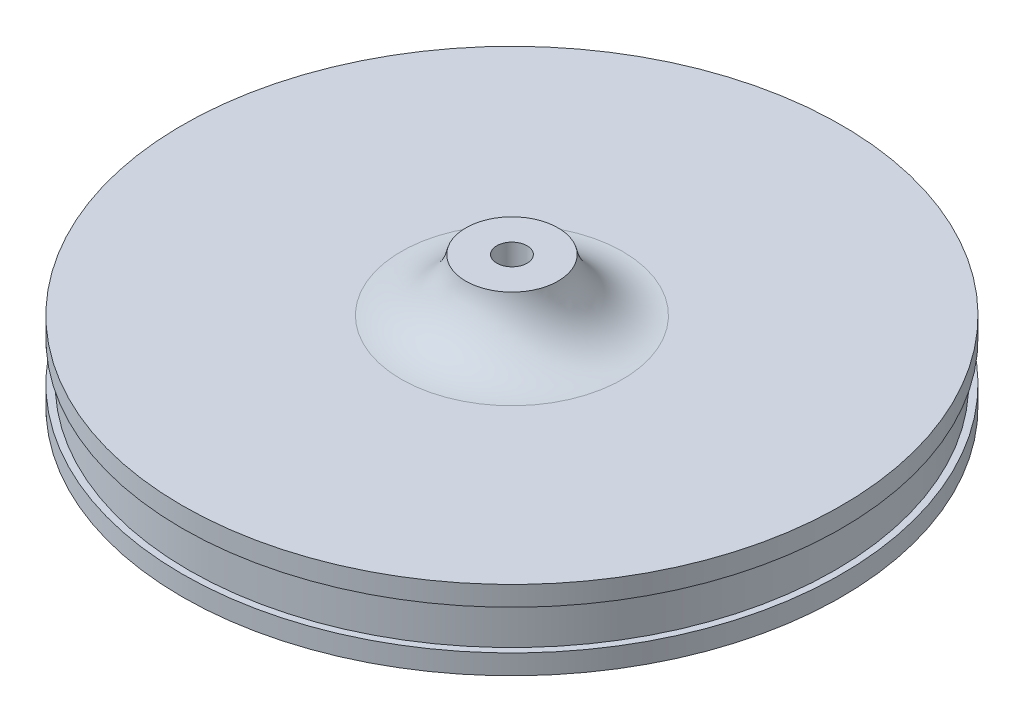
ISO-10303-21;
HEADER;
FILE_DESCRIPTION(('STEP AP214'),'2;1');
FILE_NAME('part.step','',(''),(''),'','','');
FILE_SCHEMA(('AUTOMOTIVE_DESIGN { 1 0 10303 214 1 1 1 1 }'));
ENDSEC;
DATA;
#1=APPLICATION_CONTEXT('core data for automotive mechanical design processes');
#2=APPLICATION_PROTOCOL_DEFINITION('international standard','automotive_design',2000,#1);
#3=PRODUCT_CONTEXT('',#1,'mechanical');
#4=PRODUCT('Part','Part','',(#3));
#5=PRODUCT_RELATED_PRODUCT_CATEGORY('part','',(#4));
#6=PRODUCT_DEFINITION_FORMATION('','',#4);
#7=PRODUCT_DEFINITION_CONTEXT('part definition',#1,'design');
#8=PRODUCT_DEFINITION('design','',#6,#7);
#9=PRODUCT_DEFINITION_SHAPE('','',#8);
#10=(LENGTH_UNIT() NAMED_UNIT(*) SI_UNIT(.MILLI.,.METRE.));
#11=(NAMED_UNIT(*) PLANE_ANGLE_UNIT() SI_UNIT($,.RADIAN.));
#12=(NAMED_UNIT(*) SI_UNIT($,.STERADIAN.) SOLID_ANGLE_UNIT());
#13=UNCERTAINTY_MEASURE_WITH_UNIT(LENGTH_MEASURE(1.E-05),#10,'distance_accuracy_value','');
#14=(GEOMETRIC_REPRESENTATION_CONTEXT(3) GLOBAL_UNCERTAINTY_ASSIGNED_CONTEXT((#13)) GLOBAL_UNIT_ASSIGNED_CONTEXT((#10,
#11,#12)) REPRESENTATION_CONTEXT('',''));
#15=CARTESIAN_POINT('',(0.,0.,0.));
#16=DIRECTION('',(0.,0.,1.));
#17=DIRECTION('',(1.,0.,0.));
#18=AXIS2_PLACEMENT_3D('',#15,#16,#17);
#19=CARTESIAN_POINT('',(0.,6.,0.));
#20=DIRECTION('',(0.,-1.,0.));
#21=DIRECTION('',(0.,0.,-1.));
#22=AXIS2_PLACEMENT_3D('',#19,#20,#21);
#23=CYLINDRICAL_SURFACE('',#22,25.);
#24=CARTESIAN_POINT('',(0.,0.,0.));
#25=DIRECTION('',(0.,1.,0.));
#26=DIRECTION('',(0.,0.,1.));
#27=AXIS2_PLACEMENT_3D('',#24,#25,#26);
#28=CIRCLE('',#27,25.);
#29=CARTESIAN_POINT('',(0.,0.,25.));
#30=VERTEX_POINT('',#29);
#31=EDGE_CURVE('E58',#30,#30,#28,.T.);
#32=ORIENTED_EDGE('',*,*,#31,.T.);
#33=EDGE_LOOP('',(#32));
#34=FACE_BOUND('',#33,.T.);
#35=CARTESIAN_POINT('',(0.,1.5,0.));
#36=DIRECTION('',(0.,1.,0.));
#37=DIRECTION('',(0.,0.,1.));
#38=AXIS2_PLACEMENT_3D('',#35,#36,#37);
#39=CIRCLE('',#38,25.);
#40=CARTESIAN_POINT('',(0.,1.5,25.));
#41=VERTEX_POINT('',#40);
#42=EDGE_CURVE('E77',#41,#41,#39,.T.);
#43=ORIENTED_EDGE('',*,*,#42,.F.);
#44=EDGE_LOOP('',(#43));
#45=FACE_BOUND('',#44,.T.);
#46=ADVANCED_FACE('F45',(#34,#45),#23,.T.);
#47=CARTESIAN_POINT('',(0.,6.,0.));
#48=DIRECTION('',(0.,1.,0.));
#49=DIRECTION('',(0.,0.,1.));
#50=AXIS2_PLACEMENT_3D('',#47,#48,#49);
#51=CIRCLE('',#50,25.);
#52=CARTESIAN_POINT('',(0.,6.,25.));
#53=VERTEX_POINT('',#52);
#54=EDGE_CURVE('E53',#53,#53,#51,.T.);
#55=ORIENTED_EDGE('',*,*,#54,.F.);
#56=EDGE_LOOP('',(#55));
#57=FACE_BOUND('',#56,.T.);
#58=CARTESIAN_POINT('',(0.,4.5,0.));
#59=DIRECTION('',(0.,1.,0.));
#60=DIRECTION('',(0.,0.,1.));
#61=AXIS2_PLACEMENT_3D('',#58,#59,#60);
#62=CIRCLE('',#61,25.);
#63=CARTESIAN_POINT('',(0.,4.5,25.));
#64=VERTEX_POINT('',#63);
#65=EDGE_CURVE('E89',#64,#64,#62,.T.);
#66=ORIENTED_EDGE('',*,*,#65,.T.);
#67=EDGE_LOOP('',(#66));
#68=FACE_BOUND('',#67,.T.);
#69=ADVANCED_FACE('F94',(#57,#68),#23,.T.);
#70=CARTESIAN_POINT('',(0.,6.,0.));
#71=DIRECTION('',(0.,1.,0.));
#72=DIRECTION('',(0.,0.,1.));
#73=AXIS2_PLACEMENT_3D('',#70,#71,#72);
#74=PLANE('',#73);
#75=CARTESIAN_POINT('',(0.,6.,0.));
#76=DIRECTION('',(0.,1.,0.));
#77=DIRECTION('',(0.,0.,1.));
#78=AXIS2_PLACEMENT_3D('',#75,#76,#77);
#79=CIRCLE('',#78,8.39897948556636);
#80=CARTESIAN_POINT('',(0.,6.,8.39897948556636));
#81=VERTEX_POINT('',#80);
#82=EDGE_CURVE('E11',#81,#81,#79,.F.);
#83=ORIENTED_EDGE('',*,*,#82,.T.);
#84=EDGE_LOOP('',(#83));
#85=FACE_BOUND('',#84,.T.);
#86=ORIENTED_EDGE('',*,*,#54,.T.);
#87=EDGE_LOOP('',(#86));
#88=FACE_BOUND('',#87,.T.);
#89=ADVANCED_FACE('F112',(#85,#88),#74,.T.);
#90=CARTESIAN_POINT('',(0.,0.,0.));
#91=DIRECTION('',(0.,1.,0.));
#92=DIRECTION('',(0.,0.,1.));
#93=AXIS2_PLACEMENT_3D('',#90,#91,#92);
#94=PLANE('',#93);
#95=ORIENTED_EDGE('',*,*,#31,.F.);
#96=EDGE_LOOP('',(#95));
#97=FACE_BOUND('',#96,.T.);
#98=CARTESIAN_POINT('',(0.,0.,0.));
#99=DIRECTION('',(0.,1.,0.));
#100=DIRECTION('',(0.,0.,1.));
#101=AXIS2_PLACEMENT_3D('',#98,#99,#100);
#102=CIRCLE('',#101,1.15);
#103=CARTESIAN_POINT('',(0.,0.,1.15));
#104=VERTEX_POINT('',#103);
#105=EDGE_CURVE('E64',#104,#104,#102,.T.);
#106=ORIENTED_EDGE('',*,*,#105,.T.);
#107=EDGE_LOOP('',(#106));
#108=FACE_BOUND('',#107,.T.);
#109=ADVANCED_FACE('F116',(#97,#108),#94,.F.);
#110=CARTESIAN_POINT('',(0.,6.,0.));
#111=DIRECTION('',(0.,-1.,0.));
#112=DIRECTION('',(0.,0.,-1.));
#113=AXIS2_PLACEMENT_3D('',#110,#111,#112);
#114=CYLINDRICAL_SURFACE('',#113,1.15);
#115=ORIENTED_EDGE('',*,*,#105,.F.);
#116=EDGE_LOOP('',(#115));
#117=FACE_BOUND('',#116,.T.);
#118=CARTESIAN_POINT('',(0.,10.,0.));
#119=DIRECTION('',(0.,1.,0.));
#120=DIRECTION('',(0.,0.,1.));
#121=AXIS2_PLACEMENT_3D('',#118,#119,#120);
#122=CIRCLE('',#121,1.15);
#123=CARTESIAN_POINT('',(0.,10.,1.15));
#124=VERTEX_POINT('',#123);
#125=EDGE_CURVE('E73',#124,#124,#122,.T.);
#126=ORIENTED_EDGE('',*,*,#125,.T.);
#127=EDGE_LOOP('',(#126));
#128=FACE_BOUND('',#127,.T.);
#129=ADVANCED_FACE('F119',(#117,#128),#114,.F.);
#130=CARTESIAN_POINT('',(0.,10.,0.));
#131=DIRECTION('',(0.,1.,0.));
#132=DIRECTION('',(0.,0.,1.));
#133=AXIS2_PLACEMENT_3D('',#130,#131,#132);
#134=PLANE('',#133);
#135=ORIENTED_EDGE('',*,*,#125,.F.);
#136=EDGE_LOOP('',(#135));
#137=FACE_BOUND('',#136,.T.);
#138=CARTESIAN_POINT('',(0.,10.,0.));
#139=DIRECTION('',(0.,1.,0.));
#140=DIRECTION('',(0.,0.,1.));
#141=AXIS2_PLACEMENT_3D('',#138,#139,#140);
#142=CIRCLE('',#141,3.5);
#143=CARTESIAN_POINT('',(0.,10.,3.5));
#144=VERTEX_POINT('',#143);
#145=EDGE_CURVE('E69',#144,#144,#142,.T.);
#146=ORIENTED_EDGE('',*,*,#145,.T.);
#147=EDGE_LOOP('',(#146));
#148=FACE_BOUND('',#147,.T.);
#149=ADVANCED_FACE('F125',(#137,#148),#134,.T.);
#150=CARTESIAN_POINT('',(0.,11.,0.));
#151=DIRECTION('',(0.,1.,0.));
#152=DIRECTION('',(0.,0.,1.));
#153=AXIS2_PLACEMENT_3D('',#150,#151,#152);
#154=TOROIDAL_SURFACE('',#153,8.39897948556636,5.);
#155=ORIENTED_EDGE('',*,*,#145,.F.);
#156=EDGE_LOOP('',(#155));
#157=FACE_BOUND('',#156,.T.);
#158=ORIENTED_EDGE('',*,*,#82,.F.);
#159=EDGE_LOOP('',(#158));
#160=FACE_BOUND('',#159,.T.);
#161=ADVANCED_FACE('F47',(#157,#160),#154,.F.);
#162=CARTESIAN_POINT('',(25.,1.5,0.));
#163=DIRECTION('',(0.,1.,0.));
#164=DIRECTION('',(0.,0.,1.));
#165=AXIS2_PLACEMENT_3D('',#162,#163,#164);
#166=PLANE('',#165);
#167=ORIENTED_EDGE('',*,*,#42,.T.);
#168=EDGE_LOOP('',(#167));
#169=FACE_BOUND('',#168,.T.);
#170=CARTESIAN_POINT('',(0.,1.5,0.));
#171=DIRECTION('',(0.,1.,0.));
#172=DIRECTION('',(0.,0.,1.));
#173=AXIS2_PLACEMENT_3D('',#170,#171,#172);
#174=CIRCLE('',#173,24.5);
#175=CARTESIAN_POINT('',(0.,1.5,24.5));
#176=VERTEX_POINT('',#175);
#177=EDGE_CURVE('E81',#176,#176,#174,.T.);
#178=ORIENTED_EDGE('',*,*,#177,.F.);
#179=EDGE_LOOP('',(#178));
#180=FACE_BOUND('',#179,.T.);
#181=ADVANCED_FACE('F104',(#169,#180),#166,.T.);
#182=CARTESIAN_POINT('',(0.,10.,0.));
#183=DIRECTION('',(0.,1.,0.));
#184=DIRECTION('',(0.,0.,1.));
#185=AXIS2_PLACEMENT_3D('',#182,#183,#184);
#186=CYLINDRICAL_SURFACE('',#185,24.5);
#187=ORIENTED_EDGE('',*,*,#177,.T.);
#188=EDGE_LOOP('',(#187));
#189=FACE_BOUND('',#188,.T.);
#190=CARTESIAN_POINT('',(0.,4.5,0.));
#191=DIRECTION('',(0.,1.,0.));
#192=DIRECTION('',(0.,0.,1.));
#193=AXIS2_PLACEMENT_3D('',#190,#191,#192);
#194=CIRCLE('',#193,24.5);
#195=CARTESIAN_POINT('',(0.,4.5,24.5));
#196=VERTEX_POINT('',#195);
#197=EDGE_CURVE('E85',#196,#196,#194,.T.);
#198=ORIENTED_EDGE('',*,*,#197,.F.);
#199=EDGE_LOOP('',(#198));
#200=FACE_BOUND('',#199,.T.);
#201=ADVANCED_FACE('F98',(#189,#200),#186,.T.);
#202=CARTESIAN_POINT('',(25.,4.5,0.));
#203=DIRECTION('',(0.,-1.,0.));
#204=DIRECTION('',(0.,0.,-1.));
#205=AXIS2_PLACEMENT_3D('',#202,#203,#204);
#206=PLANE('',#205);
#207=ORIENTED_EDGE('',*,*,#197,.T.);
#208=EDGE_LOOP('',(#207));
#209=FACE_BOUND('',#208,.T.);
#210=ORIENTED_EDGE('',*,*,#65,.F.);
#211=EDGE_LOOP('',(#210));
#212=FACE_BOUND('',#211,.T.);
#213=ADVANCED_FACE('F96',(#209,#212),#206,.T.);
#214=CLOSED_SHELL('',(#46,#69,#89,#109,#129,#149,#161,#181,#201,#213));
#215=MANIFOLD_SOLID_BREP('B2',#214);
#216=ADVANCED_BREP_SHAPE_REPRESENTATION('',(#18,#215),#14);
#217=SHAPE_DEFINITION_REPRESENTATION(#9,#216);
ENDSEC;
END-ISO-10303-21;
